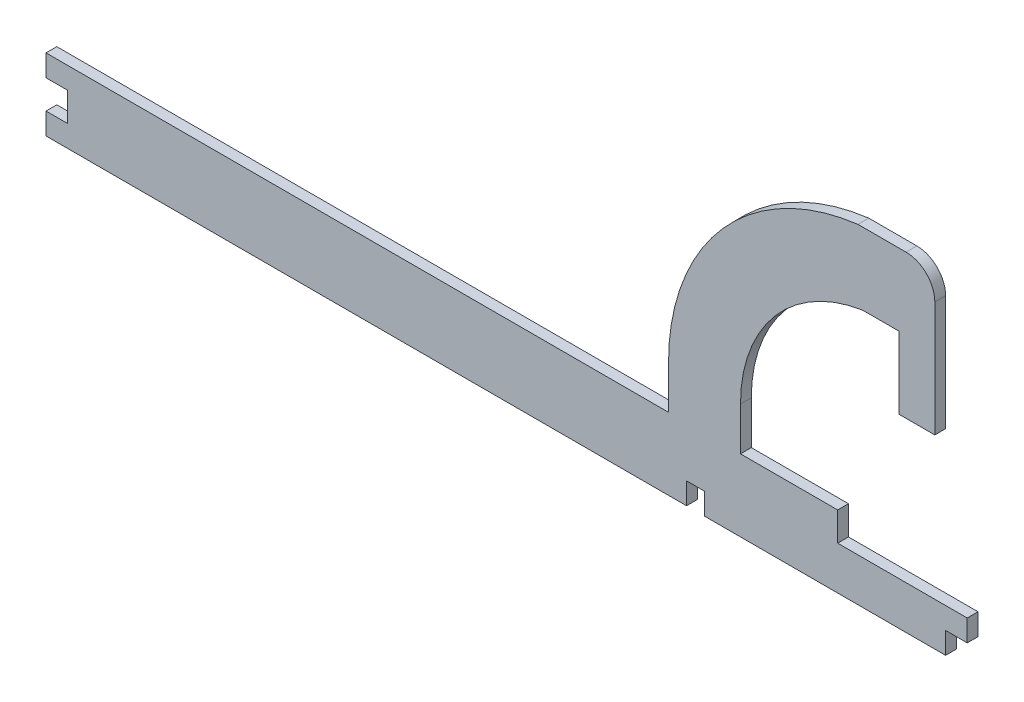
ISO-10303-21;
HEADER;
FILE_DESCRIPTION(('STEP AP214'),'2;1');
FILE_NAME('part.step','',(''),(''),'','','');
FILE_SCHEMA(('AUTOMOTIVE_DESIGN { 1 0 10303 214 1 1 1 1 }'));
ENDSEC;
DATA;
#1=APPLICATION_CONTEXT('core data for automotive mechanical design processes');
#2=APPLICATION_PROTOCOL_DEFINITION('international standard','automotive_design',2000,#1);
#3=PRODUCT_CONTEXT('',#1,'mechanical');
#4=PRODUCT('Part','Part','',(#3));
#5=PRODUCT_RELATED_PRODUCT_CATEGORY('part','',(#4));
#6=PRODUCT_DEFINITION_FORMATION('','',#4);
#7=PRODUCT_DEFINITION_CONTEXT('part definition',#1,'design');
#8=PRODUCT_DEFINITION('design','',#6,#7);
#9=PRODUCT_DEFINITION_SHAPE('','',#8);
#10=(LENGTH_UNIT() NAMED_UNIT(*) SI_UNIT(.MILLI.,.METRE.));
#11=(NAMED_UNIT(*) PLANE_ANGLE_UNIT() SI_UNIT($,.RADIAN.));
#12=(NAMED_UNIT(*) SI_UNIT($,.STERADIAN.) SOLID_ANGLE_UNIT());
#13=UNCERTAINTY_MEASURE_WITH_UNIT(LENGTH_MEASURE(1.E-05),#10,'distance_accuracy_value','');
#14=(GEOMETRIC_REPRESENTATION_CONTEXT(3) GLOBAL_UNCERTAINTY_ASSIGNED_CONTEXT((#13)) GLOBAL_UNIT_ASSIGNED_CONTEXT((#10,
#11,#12)) REPRESENTATION_CONTEXT('',''));
#15=CARTESIAN_POINT('',(0.,0.,0.));
#16=DIRECTION('',(0.,0.,1.));
#17=DIRECTION('',(1.,0.,0.));
#18=AXIS2_PLACEMENT_3D('',#15,#16,#17);
#19=CARTESIAN_POINT('',(0.,0.,3.));
#20=DIRECTION('',(0.,1.,0.));
#21=DIRECTION('',(0.,0.,1.));
#22=AXIS2_PLACEMENT_3D('',#19,#20,#21);
#23=PLANE('',#22);
#24=DIRECTION('',(1.,0.,0.));
#25=VECTOR('',#24,1.);
#26=CARTESIAN_POINT('',(0.,0.,0.));
#27=LINE('',#26,#25);
#28=CARTESIAN_POINT('',(-6.,0.,0.));
#29=VERTEX_POINT('',#28);
#30=CARTESIAN_POINT('',(172.,0.,0.));
#31=VERTEX_POINT('',#30);
#32=EDGE_CURVE('E149',#29,#31,#27,.T.);
#33=ORIENTED_EDGE('',*,*,#32,.T.);
#34=DIRECTION('',(0.,0.,-1.));
#35=VECTOR('',#34,1.);
#36=CARTESIAN_POINT('',(172.,0.,3.));
#37=LINE('',#36,#35);
#38=CARTESIAN_POINT('',(172.,0.,3.));
#39=VERTEX_POINT('',#38);
#40=EDGE_CURVE('E11',#39,#31,#37,.T.);
#41=ORIENTED_EDGE('',*,*,#40,.F.);
#42=DIRECTION('',(1.,0.,0.));
#43=VECTOR('',#42,1.);
#44=CARTESIAN_POINT('',(-6.,0.,3.));
#45=LINE('',#44,#43);
#46=CARTESIAN_POINT('',(-6.,0.,3.));
#47=VERTEX_POINT('',#46);
#48=EDGE_CURVE('E155',#47,#39,#45,.T.);
#49=ORIENTED_EDGE('',*,*,#48,.F.);
#50=DIRECTION('',(0.,0.,-1.));
#51=VECTOR('',#50,1.);
#52=CARTESIAN_POINT('',(-6.,0.,3.));
#53=LINE('',#52,#51);
#54=EDGE_CURVE('E250',#47,#29,#53,.T.);
#55=ORIENTED_EDGE('',*,*,#54,.T.);
#56=EDGE_LOOP('',(#33,#41,#49,#55));
#57=FACE_BOUND('',#56,.T.);
#58=ADVANCED_FACE('F39',(#57),#23,.F.);
#59=CARTESIAN_POINT('',(172.,0.,3.));
#60=DIRECTION('',(-1.,0.,0.));
#61=DIRECTION('',(0.,0.,1.));
#62=AXIS2_PLACEMENT_3D('',#59,#60,#61);
#63=PLANE('',#62);
#64=DIRECTION('',(0.,1.,0.));
#65=VECTOR('',#64,1.);
#66=CARTESIAN_POINT('',(172.,0.,0.));
#67=LINE('',#66,#65);
#68=CARTESIAN_POINT('',(172.,6.,0.));
#69=VERTEX_POINT('',#68);
#70=EDGE_CURVE('E256',#31,#69,#67,.T.);
#71=ORIENTED_EDGE('',*,*,#70,.T.);
#72=DIRECTION('',(0.,0.,-1.));
#73=VECTOR('',#72,1.);
#74=CARTESIAN_POINT('',(172.,6.,3.));
#75=LINE('',#74,#73);
#76=CARTESIAN_POINT('',(172.,6.,3.));
#77=VERTEX_POINT('',#76);
#78=EDGE_CURVE('E48',#77,#69,#75,.T.);
#79=ORIENTED_EDGE('',*,*,#78,.F.);
#80=DIRECTION('',(0.,1.,0.));
#81=VECTOR('',#80,1.);
#82=CARTESIAN_POINT('',(172.,0.,3.));
#83=LINE('',#82,#81);
#84=EDGE_CURVE('E524',#39,#77,#83,.T.);
#85=ORIENTED_EDGE('',*,*,#84,.F.);
#86=ORIENTED_EDGE('',*,*,#40,.T.);
#87=EDGE_LOOP('',(#71,#79,#85,#86));
#88=FACE_BOUND('',#87,.T.);
#89=ADVANCED_FACE('F529',(#88),#63,.F.);
#90=CARTESIAN_POINT('',(177.,6.,3.));
#91=DIRECTION('',(0.,1.,0.));
#92=DIRECTION('',(-1.,0.,0.));
#93=AXIS2_PLACEMENT_3D('',#90,#91,#92);
#94=PLANE('',#93);
#95=DIRECTION('',(1.,0.,0.));
#96=VECTOR('',#95,1.);
#97=CARTESIAN_POINT('',(177.,6.,0.));
#98=LINE('',#97,#96);
#99=CARTESIAN_POINT('',(177.,6.,0.));
#100=VERTEX_POINT('',#99);
#101=EDGE_CURVE('E259',#69,#100,#98,.T.);
#102=ORIENTED_EDGE('',*,*,#101,.T.);
#103=DIRECTION('',(0.,0.,-1.));
#104=VECTOR('',#103,1.);
#105=CARTESIAN_POINT('',(177.,6.,3.));
#106=LINE('',#105,#104);
#107=CARTESIAN_POINT('',(177.,6.,3.));
#108=VERTEX_POINT('',#107);
#109=EDGE_CURVE('E421',#108,#100,#106,.T.);
#110=ORIENTED_EDGE('',*,*,#109,.F.);
#111=DIRECTION('',(1.,0.,0.));
#112=VECTOR('',#111,1.);
#113=CARTESIAN_POINT('',(177.,6.,3.));
#114=LINE('',#113,#112);
#115=EDGE_CURVE('E432',#77,#108,#114,.T.);
#116=ORIENTED_EDGE('',*,*,#115,.F.);
#117=ORIENTED_EDGE('',*,*,#78,.T.);
#118=EDGE_LOOP('',(#102,#110,#116,#117));
#119=FACE_BOUND('',#118,.T.);
#120=ADVANCED_FACE('F430',(#119),#94,.F.);
#121=CARTESIAN_POINT('',(177.,0.,3.));
#122=DIRECTION('',(1.,0.,0.));
#123=DIRECTION('',(0.,0.,-1.));
#124=AXIS2_PLACEMENT_3D('',#121,#122,#123);
#125=PLANE('',#124);
#126=DIRECTION('',(0.,-1.,0.));
#127=VECTOR('',#126,1.);
#128=CARTESIAN_POINT('',(177.,0.,0.));
#129=LINE('',#128,#127);
#130=CARTESIAN_POINT('',(177.,0.,0.));
#131=VERTEX_POINT('',#130);
#132=EDGE_CURVE('E262',#100,#131,#129,.T.);
#133=ORIENTED_EDGE('',*,*,#132,.T.);
#134=DIRECTION('',(0.,0.,-1.));
#135=VECTOR('',#134,1.);
#136=CARTESIAN_POINT('',(177.,0.,3.));
#137=LINE('',#136,#135);
#138=CARTESIAN_POINT('',(177.,0.,3.));
#139=VERTEX_POINT('',#138);
#140=EDGE_CURVE('E417',#139,#131,#137,.T.);
#141=ORIENTED_EDGE('',*,*,#140,.F.);
#142=DIRECTION('',(0.,-1.,0.));
#143=VECTOR('',#142,1.);
#144=CARTESIAN_POINT('',(177.,0.,3.));
#145=LINE('',#144,#143);
#146=EDGE_CURVE('E451',#108,#139,#145,.T.);
#147=ORIENTED_EDGE('',*,*,#146,.F.);
#148=ORIENTED_EDGE('',*,*,#109,.T.);
#149=EDGE_LOOP('',(#133,#141,#147,#148));
#150=FACE_BOUND('',#149,.T.);
#151=ADVANCED_FACE('F441',(#150),#125,.F.);
#152=CARTESIAN_POINT('',(177.,0.,3.));
#153=DIRECTION('',(0.,1.,0.));
#154=DIRECTION('',(0.,0.,1.));
#155=AXIS2_PLACEMENT_3D('',#152,#153,#154);
#156=PLANE('',#155);
#157=DIRECTION('',(1.,0.,0.));
#158=VECTOR('',#157,1.);
#159=CARTESIAN_POINT('',(177.,0.,0.));
#160=LINE('',#159,#158);
#161=CARTESIAN_POINT('',(244.,0.,0.));
#162=VERTEX_POINT('',#161);
#163=EDGE_CURVE('E265',#131,#162,#160,.T.);
#164=ORIENTED_EDGE('',*,*,#163,.T.);
#165=DIRECTION('',(0.,0.,-1.));
#166=VECTOR('',#165,1.);
#167=CARTESIAN_POINT('',(244.,0.,3.));
#168=LINE('',#167,#166);
#169=CARTESIAN_POINT('',(244.,0.,3.));
#170=VERTEX_POINT('',#169);
#171=EDGE_CURVE('E413',#170,#162,#168,.T.);
#172=ORIENTED_EDGE('',*,*,#171,.F.);
#173=DIRECTION('',(1.,0.,0.));
#174=VECTOR('',#173,1.);
#175=CARTESIAN_POINT('',(177.,0.,3.));
#176=LINE('',#175,#174);
#177=EDGE_CURVE('E447',#139,#170,#176,.T.);
#178=ORIENTED_EDGE('',*,*,#177,.F.);
#179=ORIENTED_EDGE('',*,*,#140,.T.);
#180=EDGE_LOOP('',(#164,#172,#178,#179));
#181=FACE_BOUND('',#180,.T.);
#182=ADVANCED_FACE('F445',(#181),#156,.F.);
#183=CARTESIAN_POINT('',(244.,6.,3.));
#184=DIRECTION('',(-1.,0.,0.));
#185=DIRECTION('',(0.,0.,1.));
#186=AXIS2_PLACEMENT_3D('',#183,#184,#185);
#187=PLANE('',#186);
#188=DIRECTION('',(0.,1.,0.));
#189=VECTOR('',#188,1.);
#190=CARTESIAN_POINT('',(244.,6.,0.));
#191=LINE('',#190,#189);
#192=CARTESIAN_POINT('',(244.,6.,0.));
#193=VERTEX_POINT('',#192);
#194=EDGE_CURVE('E268',#162,#193,#191,.T.);
#195=ORIENTED_EDGE('',*,*,#194,.T.);
#196=DIRECTION('',(0.,0.,-1.));
#197=VECTOR('',#196,1.);
#198=CARTESIAN_POINT('',(244.,6.,3.));
#199=LINE('',#198,#197);
#200=CARTESIAN_POINT('',(244.,6.,3.));
#201=VERTEX_POINT('',#200);
#202=EDGE_CURVE('E409',#201,#193,#199,.T.);
#203=ORIENTED_EDGE('',*,*,#202,.F.);
#204=DIRECTION('',(0.,1.,0.));
#205=VECTOR('',#204,1.);
#206=CARTESIAN_POINT('',(244.,6.,3.));
#207=LINE('',#206,#205);
#208=EDGE_CURVE('E450',#170,#201,#207,.T.);
#209=ORIENTED_EDGE('',*,*,#208,.F.);
#210=ORIENTED_EDGE('',*,*,#171,.T.);
#211=EDGE_LOOP('',(#195,#203,#209,#210));
#212=FACE_BOUND('',#211,.T.);
#213=ADVANCED_FACE('F541',(#212),#187,.F.);
#214=CARTESIAN_POINT('',(250.,6.,3.));
#215=DIRECTION('',(0.,1.,0.));
#216=DIRECTION('',(-1.,0.,0.));
#217=AXIS2_PLACEMENT_3D('',#214,#215,#216);
#218=PLANE('',#217);
#219=DIRECTION('',(1.,0.,0.));
#220=VECTOR('',#219,1.);
#221=CARTESIAN_POINT('',(250.,6.,0.));
#222=LINE('',#221,#220);
#223=CARTESIAN_POINT('',(250.,6.,0.));
#224=VERTEX_POINT('',#223);
#225=EDGE_CURVE('E271',#193,#224,#222,.T.);
#226=ORIENTED_EDGE('',*,*,#225,.T.);
#227=DIRECTION('',(0.,0.,-1.));
#228=VECTOR('',#227,1.);
#229=CARTESIAN_POINT('',(250.,6.,3.));
#230=LINE('',#229,#228);
#231=CARTESIAN_POINT('',(250.,6.,3.));
#232=VERTEX_POINT('',#231);
#233=EDGE_CURVE('E405',#232,#224,#230,.T.);
#234=ORIENTED_EDGE('',*,*,#233,.F.);
#235=DIRECTION('',(1.,0.,0.));
#236=VECTOR('',#235,1.);
#237=CARTESIAN_POINT('',(250.,6.,3.));
#238=LINE('',#237,#236);
#239=EDGE_CURVE('E455',#201,#232,#238,.T.);
#240=ORIENTED_EDGE('',*,*,#239,.F.);
#241=ORIENTED_EDGE('',*,*,#202,.T.);
#242=EDGE_LOOP('',(#226,#234,#240,#241));
#243=FACE_BOUND('',#242,.T.);
#244=ADVANCED_FACE('F544',(#243),#218,.F.);
#245=CARTESIAN_POINT('',(250.,12.,3.));
#246=DIRECTION('',(-1.,0.,0.));
#247=DIRECTION('',(0.,0.,1.));
#248=AXIS2_PLACEMENT_3D('',#245,#246,#247);
#249=PLANE('',#248);
#250=DIRECTION('',(0.,1.,0.));
#251=VECTOR('',#250,1.);
#252=CARTESIAN_POINT('',(250.,12.,0.));
#253=LINE('',#252,#251);
#254=CARTESIAN_POINT('',(250.,12.,0.));
#255=VERTEX_POINT('',#254);
#256=EDGE_CURVE('E274',#224,#255,#253,.T.);
#257=ORIENTED_EDGE('',*,*,#256,.T.);
#258=DIRECTION('',(0.,0.,-1.));
#259=VECTOR('',#258,1.);
#260=CARTESIAN_POINT('',(250.,12.,3.));
#261=LINE('',#260,#259);
#262=CARTESIAN_POINT('',(250.,12.,3.));
#263=VERTEX_POINT('',#262);
#264=EDGE_CURVE('E401',#263,#255,#261,.T.);
#265=ORIENTED_EDGE('',*,*,#264,.F.);
#266=DIRECTION('',(0.,1.,0.));
#267=VECTOR('',#266,1.);
#268=CARTESIAN_POINT('',(250.,12.,3.));
#269=LINE('',#268,#267);
#270=EDGE_CURVE('E462',#232,#263,#269,.T.);
#271=ORIENTED_EDGE('',*,*,#270,.F.);
#272=ORIENTED_EDGE('',*,*,#233,.T.);
#273=EDGE_LOOP('',(#257,#265,#271,#272));
#274=FACE_BOUND('',#273,.T.);
#275=ADVANCED_FACE('F548',(#274),#249,.F.);
#276=CARTESIAN_POINT('',(214.,12.,3.));
#277=DIRECTION('',(0.,-1.,0.));
#278=DIRECTION('',(0.,0.,-1.));
#279=AXIS2_PLACEMENT_3D('',#276,#277,#278);
#280=PLANE('',#279);
#281=DIRECTION('',(-1.,0.,0.));
#282=VECTOR('',#281,1.);
#283=CARTESIAN_POINT('',(214.,12.,0.));
#284=LINE('',#283,#282);
#285=CARTESIAN_POINT('',(214.,12.,0.));
#286=VERTEX_POINT('',#285);
#287=EDGE_CURVE('E278',#255,#286,#284,.T.);
#288=ORIENTED_EDGE('',*,*,#287,.T.);
#289=DIRECTION('',(0.,0.,-1.));
#290=VECTOR('',#289,1.);
#291=CARTESIAN_POINT('',(214.,12.,3.));
#292=LINE('',#291,#290);
#293=CARTESIAN_POINT('',(214.,12.,3.));
#294=VERTEX_POINT('',#293);
#295=EDGE_CURVE('E397',#294,#286,#292,.T.);
#296=ORIENTED_EDGE('',*,*,#295,.F.);
#297=DIRECTION('',(-1.,0.,0.));
#298=VECTOR('',#297,1.);
#299=CARTESIAN_POINT('',(244.,12.,3.));
#300=LINE('',#299,#298);
#301=EDGE_CURVE('E465',#263,#294,#300,.T.);
#302=ORIENTED_EDGE('',*,*,#301,.F.);
#303=ORIENTED_EDGE('',*,*,#264,.T.);
#304=EDGE_LOOP('',(#288,#296,#302,#303));
#305=FACE_BOUND('',#304,.T.);
#306=ADVANCED_FACE('F552',(#305),#280,.F.);
#307=CARTESIAN_POINT('',(214.,20.,3.));
#308=DIRECTION('',(-1.,0.,0.));
#309=DIRECTION('',(0.,0.,1.));
#310=AXIS2_PLACEMENT_3D('',#307,#308,#309);
#311=PLANE('',#310);
#312=DIRECTION('',(0.,1.,0.));
#313=VECTOR('',#312,1.);
#314=CARTESIAN_POINT('',(214.,20.,0.));
#315=LINE('',#314,#313);
#316=CARTESIAN_POINT('',(214.,20.,0.));
#317=VERTEX_POINT('',#316);
#318=EDGE_CURVE('E281',#286,#317,#315,.T.);
#319=ORIENTED_EDGE('',*,*,#318,.T.);
#320=DIRECTION('',(0.,0.,-1.));
#321=VECTOR('',#320,1.);
#322=CARTESIAN_POINT('',(214.,20.,3.));
#323=LINE('',#322,#321);
#324=CARTESIAN_POINT('',(214.,20.,3.));
#325=VERTEX_POINT('',#324);
#326=EDGE_CURVE('E393',#325,#317,#323,.T.);
#327=ORIENTED_EDGE('',*,*,#326,.F.);
#328=DIRECTION('',(0.,1.,0.));
#329=VECTOR('',#328,1.);
#330=CARTESIAN_POINT('',(214.,20.,3.));
#331=LINE('',#330,#329);
#332=EDGE_CURVE('E468',#294,#325,#331,.T.);
#333=ORIENTED_EDGE('',*,*,#332,.F.);
#334=ORIENTED_EDGE('',*,*,#295,.T.);
#335=EDGE_LOOP('',(#319,#327,#333,#334));
#336=FACE_BOUND('',#335,.T.);
#337=ADVANCED_FACE('F556',(#336),#311,.F.);
#338=CARTESIAN_POINT('',(187.,20.,3.));
#339=DIRECTION('',(0.,-1.,0.));
#340=DIRECTION('',(0.,0.,-1.));
#341=AXIS2_PLACEMENT_3D('',#338,#339,#340);
#342=PLANE('',#341);
#343=DIRECTION('',(-1.,0.,0.));
#344=VECTOR('',#343,1.);
#345=CARTESIAN_POINT('',(187.,20.,0.));
#346=LINE('',#345,#344);
#347=CARTESIAN_POINT('',(187.,20.,0.));
#348=VERTEX_POINT('',#347);
#349=EDGE_CURVE('E284',#317,#348,#346,.T.);
#350=ORIENTED_EDGE('',*,*,#349,.T.);
#351=DIRECTION('',(0.,0.,-1.));
#352=VECTOR('',#351,1.);
#353=CARTESIAN_POINT('',(187.,20.,3.));
#354=LINE('',#353,#352);
#355=CARTESIAN_POINT('',(187.,20.,3.));
#356=VERTEX_POINT('',#355);
#357=EDGE_CURVE('E389',#356,#348,#354,.T.);
#358=ORIENTED_EDGE('',*,*,#357,.F.);
#359=DIRECTION('',(-1.,0.,0.));
#360=VECTOR('',#359,1.);
#361=CARTESIAN_POINT('',(187.,20.,3.));
#362=LINE('',#361,#360);
#363=EDGE_CURVE('E471',#325,#356,#362,.T.);
#364=ORIENTED_EDGE('',*,*,#363,.F.);
#365=ORIENTED_EDGE('',*,*,#326,.T.);
#366=EDGE_LOOP('',(#350,#358,#364,#365));
#367=FACE_BOUND('',#366,.T.);
#368=ADVANCED_FACE('F560',(#367),#342,.F.);
#369=CARTESIAN_POINT('',(187.,20.,3.));
#370=DIRECTION('',(-1.,0.,0.));
#371=DIRECTION('',(0.,0.,1.));
#372=AXIS2_PLACEMENT_3D('',#369,#370,#371);
#373=PLANE('',#372);
#374=DIRECTION('',(0.,1.,0.));
#375=VECTOR('',#374,1.);
#376=CARTESIAN_POINT('',(187.,20.,0.));
#377=LINE('',#376,#375);
#378=CARTESIAN_POINT('',(187.,32.,0.));
#379=VERTEX_POINT('',#378);
#380=EDGE_CURVE('E287',#348,#379,#377,.T.);
#381=ORIENTED_EDGE('',*,*,#380,.T.);
#382=DIRECTION('',(0.,0.,-1.));
#383=VECTOR('',#382,1.);
#384=CARTESIAN_POINT('',(187.,32.,3.));
#385=LINE('',#384,#383);
#386=CARTESIAN_POINT('',(187.,32.,3.));
#387=VERTEX_POINT('',#386);
#388=EDGE_CURVE('E385',#387,#379,#385,.T.);
#389=ORIENTED_EDGE('',*,*,#388,.F.);
#390=DIRECTION('',(0.,1.,0.));
#391=VECTOR('',#390,1.);
#392=CARTESIAN_POINT('',(187.,20.,3.));
#393=LINE('',#392,#391);
#394=EDGE_CURVE('E474',#356,#387,#393,.T.);
#395=ORIENTED_EDGE('',*,*,#394,.F.);
#396=ORIENTED_EDGE('',*,*,#357,.T.);
#397=EDGE_LOOP('',(#381,#389,#395,#396));
#398=FACE_BOUND('',#397,.T.);
#399=ADVANCED_FACE('F564',(#398),#373,.F.);
#400=CARTESIAN_POINT('',(227.,32.,3.));
#401=DIRECTION('',(0.,0.,-1.));
#402=DIRECTION('',(-1.,0.,0.));
#403=AXIS2_PLACEMENT_3D('',#400,#401,#402);
#404=CYLINDRICAL_SURFACE('',#403,40.);
#405=CARTESIAN_POINT('',(227.,32.,0.));
#406=DIRECTION('',(0.,0.,-1.));
#407=DIRECTION('',(1.,0.,0.));
#408=AXIS2_PLACEMENT_3D('',#405,#406,#407);
#409=CIRCLE('',#408,40.);
#410=CARTESIAN_POINT('',(221.,71.5474398665704,0.));
#411=VERTEX_POINT('',#410);
#412=EDGE_CURVE('E290',#379,#411,#409,.T.);
#413=ORIENTED_EDGE('',*,*,#412,.T.);
#414=DIRECTION('',(0.,0.,-1.));
#415=VECTOR('',#414,1.);
#416=CARTESIAN_POINT('',(221.,71.5474398665704,3.));
#417=LINE('',#416,#415);
#418=CARTESIAN_POINT('',(221.,71.5474398665704,3.));
#419=VERTEX_POINT('',#418);
#420=EDGE_CURVE('E381',#419,#411,#417,.T.);
#421=ORIENTED_EDGE('',*,*,#420,.F.);
#422=CARTESIAN_POINT('',(227.,32.,3.));
#423=DIRECTION('',(0.,0.,-1.));
#424=DIRECTION('',(1.,0.,0.));
#425=AXIS2_PLACEMENT_3D('',#422,#423,#424);
#426=CIRCLE('',#425,40.);
#427=EDGE_CURVE('E477',#387,#419,#426,.T.);
#428=ORIENTED_EDGE('',*,*,#427,.F.);
#429=ORIENTED_EDGE('',*,*,#388,.T.);
#430=EDGE_LOOP('',(#413,#421,#428,#429));
#431=FACE_BOUND('',#430,.T.);
#432=ADVANCED_FACE('F568',(#431),#404,.F.);
#433=CARTESIAN_POINT('',(231.,71.5474398665704,3.));
#434=DIRECTION('',(0.,1.,0.));
#435=DIRECTION('',(0.,0.,1.));
#436=AXIS2_PLACEMENT_3D('',#433,#434,#435);
#437=PLANE('',#436);
#438=DIRECTION('',(1.,0.,0.));
#439=VECTOR('',#438,1.);
#440=CARTESIAN_POINT('',(231.,71.5474398665704,0.));
#441=LINE('',#440,#439);
#442=CARTESIAN_POINT('',(231.,71.5474398665704,0.));
#443=VERTEX_POINT('',#442);
#444=EDGE_CURVE('E293',#411,#443,#441,.T.);
#445=ORIENTED_EDGE('',*,*,#444,.T.);
#446=DIRECTION('',(0.,0.,-1.));
#447=VECTOR('',#446,1.);
#448=CARTESIAN_POINT('',(231.,71.5474398665704,3.));
#449=LINE('',#448,#447);
#450=CARTESIAN_POINT('',(231.,71.5474398665704,3.));
#451=VERTEX_POINT('',#450);
#452=EDGE_CURVE('E377',#451,#443,#449,.T.);
#453=ORIENTED_EDGE('',*,*,#452,.F.);
#454=DIRECTION('',(1.,0.,0.));
#455=VECTOR('',#454,1.);
#456=CARTESIAN_POINT('',(231.,71.5474398665704,3.));
#457=LINE('',#456,#455);
#458=EDGE_CURVE('E480',#419,#451,#457,.T.);
#459=ORIENTED_EDGE('',*,*,#458,.F.);
#460=ORIENTED_EDGE('',*,*,#420,.T.);
#461=EDGE_LOOP('',(#445,#453,#459,#460));
#462=FACE_BOUND('',#461,.T.);
#463=ADVANCED_FACE('F572',(#462),#437,.F.);
#464=CARTESIAN_POINT('',(231.,71.5474398665704,3.));
#465=DIRECTION('',(1.,0.,0.));
#466=DIRECTION('',(0.,0.,-1.));
#467=AXIS2_PLACEMENT_3D('',#464,#465,#466);
#468=PLANE('',#467);
#469=DIRECTION('',(0.,-1.,0.));
#470=VECTOR('',#469,1.);
#471=CARTESIAN_POINT('',(231.,71.5474398665704,0.));
#472=LINE('',#471,#470);
#473=CARTESIAN_POINT('',(231.,51.5474398665704,0.));
#474=VERTEX_POINT('',#473);
#475=EDGE_CURVE('E296',#443,#474,#472,.T.);
#476=ORIENTED_EDGE('',*,*,#475,.T.);
#477=DIRECTION('',(0.,0.,-1.));
#478=VECTOR('',#477,1.);
#479=CARTESIAN_POINT('',(231.,51.5474398665704,3.));
#480=LINE('',#479,#478);
#481=CARTESIAN_POINT('',(231.,51.5474398665704,3.));
#482=VERTEX_POINT('',#481);
#483=EDGE_CURVE('E373',#482,#474,#480,.T.);
#484=ORIENTED_EDGE('',*,*,#483,.F.);
#485=DIRECTION('',(0.,-1.,0.));
#486=VECTOR('',#485,1.);
#487=CARTESIAN_POINT('',(231.,71.5474398665704,3.));
#488=LINE('',#487,#486);
#489=EDGE_CURVE('E483',#451,#482,#488,.T.);
#490=ORIENTED_EDGE('',*,*,#489,.F.);
#491=ORIENTED_EDGE('',*,*,#452,.T.);
#492=EDGE_LOOP('',(#476,#484,#490,#491));
#493=FACE_BOUND('',#492,.T.);
#494=ADVANCED_FACE('F576',(#493),#468,.F.);
#495=CARTESIAN_POINT('',(231.,51.5474398665704,3.));
#496=DIRECTION('',(0.,1.,0.));
#497=DIRECTION('',(0.,0.,1.));
#498=AXIS2_PLACEMENT_3D('',#495,#496,#497);
#499=PLANE('',#498);
#500=DIRECTION('',(1.,0.,0.));
#501=VECTOR('',#500,1.);
#502=CARTESIAN_POINT('',(231.,51.5474398665704,0.));
#503=LINE('',#502,#501);
#504=CARTESIAN_POINT('',(241.,51.5474398665704,0.));
#505=VERTEX_POINT('',#504);
#506=EDGE_CURVE('E299',#474,#505,#503,.T.);
#507=ORIENTED_EDGE('',*,*,#506,.T.);
#508=DIRECTION('',(0.,0.,-1.));
#509=VECTOR('',#508,1.);
#510=CARTESIAN_POINT('',(241.,51.5474398665704,3.));
#511=LINE('',#510,#509);
#512=CARTESIAN_POINT('',(241.,51.5474398665704,3.));
#513=VERTEX_POINT('',#512);
#514=EDGE_CURVE('E369',#513,#505,#511,.T.);
#515=ORIENTED_EDGE('',*,*,#514,.F.);
#516=DIRECTION('',(1.,0.,0.));
#517=VECTOR('',#516,1.);
#518=CARTESIAN_POINT('',(231.,51.5474398665704,3.));
#519=LINE('',#518,#517);
#520=EDGE_CURVE('E486',#482,#513,#519,.T.);
#521=ORIENTED_EDGE('',*,*,#520,.F.);
#522=ORIENTED_EDGE('',*,*,#483,.T.);
#523=EDGE_LOOP('',(#507,#515,#521,#522));
#524=FACE_BOUND('',#523,.T.);
#525=ADVANCED_FACE('F580',(#524),#499,.F.);
#526=CARTESIAN_POINT('',(241.,83.5474398665704,3.));
#527=DIRECTION('',(-1.,0.,0.));
#528=DIRECTION('',(0.,0.,1.));
#529=AXIS2_PLACEMENT_3D('',#526,#527,#528);
#530=PLANE('',#529);
#531=DIRECTION('',(0.,1.,0.));
#532=VECTOR('',#531,1.);
#533=CARTESIAN_POINT('',(241.,83.5474398665704,0.));
#534=LINE('',#533,#532);
#535=CARTESIAN_POINT('',(241.,83.5474398665704,0.));
#536=VERTEX_POINT('',#535);
#537=EDGE_CURVE('E302',#505,#536,#534,.T.);
#538=ORIENTED_EDGE('',*,*,#537,.T.);
#539=DIRECTION('',(0.,0.,-1.));
#540=VECTOR('',#539,1.);
#541=CARTESIAN_POINT('',(241.,83.5474398665704,3.));
#542=LINE('',#541,#540);
#543=CARTESIAN_POINT('',(241.,83.5474398665704,3.));
#544=VERTEX_POINT('',#543);
#545=EDGE_CURVE('E365',#544,#536,#542,.T.);
#546=ORIENTED_EDGE('',*,*,#545,.F.);
#547=DIRECTION('',(0.,1.,0.));
#548=VECTOR('',#547,1.);
#549=CARTESIAN_POINT('',(241.,83.5474398665704,3.));
#550=LINE('',#549,#548);
#551=EDGE_CURVE('E489',#513,#544,#550,.T.);
#552=ORIENTED_EDGE('',*,*,#551,.F.);
#553=ORIENTED_EDGE('',*,*,#514,.T.);
#554=EDGE_LOOP('',(#538,#546,#552,#553));
#555=FACE_BOUND('',#554,.T.);
#556=ADVANCED_FACE('F584',(#555),#530,.F.);
#557=CARTESIAN_POINT('',(233.,83.5474398665704,3.));
#558=DIRECTION('',(0.,0.,-1.));
#559=DIRECTION('',(-1.,0.,0.));
#560=AXIS2_PLACEMENT_3D('',#557,#558,#559);
#561=CYLINDRICAL_SURFACE('',#560,8.00000000000001);
#562=CARTESIAN_POINT('',(233.,83.5474398665704,0.));
#563=DIRECTION('',(0.,0.,1.));
#564=DIRECTION('',(1.,0.,0.));
#565=AXIS2_PLACEMENT_3D('',#562,#563,#564);
#566=CIRCLE('',#565,8.00000000000001);
#567=CARTESIAN_POINT('',(233.,91.5474398665704,0.));
#568=VERTEX_POINT('',#567);
#569=EDGE_CURVE('E305',#536,#568,#566,.T.);
#570=ORIENTED_EDGE('',*,*,#569,.T.);
#571=DIRECTION('',(0.,0.,-1.));
#572=VECTOR('',#571,1.);
#573=CARTESIAN_POINT('',(233.,91.5474398665704,3.));
#574=LINE('',#573,#572);
#575=CARTESIAN_POINT('',(233.,91.5474398665704,3.));
#576=VERTEX_POINT('',#575);
#577=EDGE_CURVE('E361',#576,#568,#574,.T.);
#578=ORIENTED_EDGE('',*,*,#577,.F.);
#579=CARTESIAN_POINT('',(233.,83.5474398665704,3.));
#580=DIRECTION('',(0.,0.,1.));
#581=DIRECTION('',(1.,0.,0.));
#582=AXIS2_PLACEMENT_3D('',#579,#580,#581);
#583=CIRCLE('',#582,8.00000000000001);
#584=EDGE_CURVE('E492',#544,#576,#583,.T.);
#585=ORIENTED_EDGE('',*,*,#584,.F.);
#586=ORIENTED_EDGE('',*,*,#545,.T.);
#587=EDGE_LOOP('',(#570,#578,#585,#586));
#588=FACE_BOUND('',#587,.T.);
#589=ADVANCED_FACE('F588',(#588),#561,.T.);
#590=CARTESIAN_POINT('',(233.,91.5474398665704,3.));
#591=DIRECTION('',(0.,-1.,0.));
#592=DIRECTION('',(0.,0.,-1.));
#593=AXIS2_PLACEMENT_3D('',#590,#591,#592);
#594=PLANE('',#593);
#595=DIRECTION('',(-1.,0.,0.));
#596=VECTOR('',#595,1.);
#597=CARTESIAN_POINT('',(233.,91.5474398665704,0.));
#598=LINE('',#597,#596);
#599=CARTESIAN_POINT('',(219.644566271308,91.5474398665704,0.));
#600=VERTEX_POINT('',#599);
#601=EDGE_CURVE('E308',#568,#600,#598,.T.);
#602=ORIENTED_EDGE('',*,*,#601,.T.);
#603=DIRECTION('',(0.,0.,-1.));
#604=VECTOR('',#603,1.);
#605=CARTESIAN_POINT('',(219.644566271308,91.5474398665704,3.));
#606=LINE('',#605,#604);
#607=CARTESIAN_POINT('',(219.644566271308,91.5474398665704,3.));
#608=VERTEX_POINT('',#607);
#609=EDGE_CURVE('E357',#608,#600,#606,.T.);
#610=ORIENTED_EDGE('',*,*,#609,.F.);
#611=DIRECTION('',(-1.,0.,0.));
#612=VECTOR('',#611,1.);
#613=CARTESIAN_POINT('',(233.,91.5474398665704,3.));
#614=LINE('',#613,#612);
#615=EDGE_CURVE('E495',#576,#608,#614,.T.);
#616=ORIENTED_EDGE('',*,*,#615,.F.);
#617=ORIENTED_EDGE('',*,*,#577,.T.);
#618=EDGE_LOOP('',(#602,#610,#616,#617));
#619=FACE_BOUND('',#618,.T.);
#620=ADVANCED_FACE('F592',(#619),#594,.F.);
#621=CARTESIAN_POINT('',(227.,32.,3.));
#622=DIRECTION('',(0.,0.,-1.));
#623=DIRECTION('',(-1.,0.,0.));
#624=AXIS2_PLACEMENT_3D('',#621,#622,#623);
#625=CYLINDRICAL_SURFACE('',#624,60.);
#626=CARTESIAN_POINT('',(227.,32.,0.));
#627=DIRECTION('',(0.,0.,1.));
#628=DIRECTION('',(1.,0.,0.));
#629=AXIS2_PLACEMENT_3D('',#626,#627,#628);
#630=CIRCLE('',#629,60.);
#631=CARTESIAN_POINT('',(167.,32.,0.));
#632=VERTEX_POINT('',#631);
#633=EDGE_CURVE('E311',#600,#632,#630,.T.);
#634=ORIENTED_EDGE('',*,*,#633,.T.);
#635=DIRECTION('',(0.,0.,-1.));
#636=VECTOR('',#635,1.);
#637=CARTESIAN_POINT('',(167.,32.,3.));
#638=LINE('',#637,#636);
#639=CARTESIAN_POINT('',(167.,32.,3.));
#640=VERTEX_POINT('',#639);
#641=EDGE_CURVE('E353',#640,#632,#638,.T.);
#642=ORIENTED_EDGE('',*,*,#641,.F.);
#643=CARTESIAN_POINT('',(227.,32.,3.));
#644=DIRECTION('',(0.,0.,1.));
#645=DIRECTION('',(1.,0.,0.));
#646=AXIS2_PLACEMENT_3D('',#643,#644,#645);
#647=CIRCLE('',#646,60.);
#648=EDGE_CURVE('E498',#608,#640,#647,.T.);
#649=ORIENTED_EDGE('',*,*,#648,.F.);
#650=ORIENTED_EDGE('',*,*,#609,.T.);
#651=EDGE_LOOP('',(#634,#642,#649,#650));
#652=FACE_BOUND('',#651,.T.);
#653=ADVANCED_FACE('F596',(#652),#625,.T.);
#654=CARTESIAN_POINT('',(167.,32.,3.));
#655=DIRECTION('',(1.,0.,0.));
#656=DIRECTION('',(0.,0.,-1.));
#657=AXIS2_PLACEMENT_3D('',#654,#655,#656);
#658=PLANE('',#657);
#659=DIRECTION('',(0.,-1.,0.));
#660=VECTOR('',#659,1.);
#661=CARTESIAN_POINT('',(167.,32.,0.));
#662=LINE('',#661,#660);
#663=CARTESIAN_POINT('',(167.,20.,0.));
#664=VERTEX_POINT('',#663);
#665=EDGE_CURVE('E314',#632,#664,#662,.T.);
#666=ORIENTED_EDGE('',*,*,#665,.T.);
#667=DIRECTION('',(0.,0.,-1.));
#668=VECTOR('',#667,1.);
#669=CARTESIAN_POINT('',(167.,20.,3.));
#670=LINE('',#669,#668);
#671=CARTESIAN_POINT('',(167.,20.,3.));
#672=VERTEX_POINT('',#671);
#673=EDGE_CURVE('E349',#672,#664,#670,.T.);
#674=ORIENTED_EDGE('',*,*,#673,.F.);
#675=DIRECTION('',(0.,-1.,0.));
#676=VECTOR('',#675,1.);
#677=CARTESIAN_POINT('',(167.,32.,3.));
#678=LINE('',#677,#676);
#679=EDGE_CURVE('E501',#640,#672,#678,.T.);
#680=ORIENTED_EDGE('',*,*,#679,.F.);
#681=ORIENTED_EDGE('',*,*,#641,.T.);
#682=EDGE_LOOP('',(#666,#674,#680,#681));
#683=FACE_BOUND('',#682,.T.);
#684=ADVANCED_FACE('F600',(#683),#658,.F.);
#685=CARTESIAN_POINT('',(0.,20.,3.));
#686=DIRECTION('',(0.,-1.,0.));
#687=DIRECTION('',(0.,0.,-1.));
#688=AXIS2_PLACEMENT_3D('',#685,#686,#687);
#689=PLANE('',#688);
#690=DIRECTION('',(-1.,0.,0.));
#691=VECTOR('',#690,1.);
#692=CARTESIAN_POINT('',(0.,20.,0.));
#693=LINE('',#692,#691);
#694=CARTESIAN_POINT('',(-6.,20.,0.));
#695=VERTEX_POINT('',#694);
#696=EDGE_CURVE('E318',#664,#695,#693,.T.);
#697=ORIENTED_EDGE('',*,*,#696,.T.);
#698=DIRECTION('',(0.,0.,-1.));
#699=VECTOR('',#698,1.);
#700=CARTESIAN_POINT('',(-6.,20.,3.));
#701=LINE('',#700,#699);
#702=CARTESIAN_POINT('',(-6.,20.,3.));
#703=VERTEX_POINT('',#702);
#704=EDGE_CURVE('E345',#703,#695,#701,.T.);
#705=ORIENTED_EDGE('',*,*,#704,.F.);
#706=DIRECTION('',(-1.,0.,0.));
#707=VECTOR('',#706,1.);
#708=CARTESIAN_POINT('',(0.,20.,3.));
#709=LINE('',#708,#707);
#710=EDGE_CURVE('E504',#672,#703,#709,.T.);
#711=ORIENTED_EDGE('',*,*,#710,.F.);
#712=ORIENTED_EDGE('',*,*,#673,.T.);
#713=EDGE_LOOP('',(#697,#705,#711,#712));
#714=FACE_BOUND('',#713,.T.);
#715=ADVANCED_FACE('F604',(#714),#689,.F.);
#716=CARTESIAN_POINT('',(-6.,20.,3.));
#717=DIRECTION('',(1.,0.,0.));
#718=DIRECTION('',(0.,0.,-1.));
#719=AXIS2_PLACEMENT_3D('',#716,#717,#718);
#720=PLANE('',#719);
#721=DIRECTION('',(0.,-1.,0.));
#722=VECTOR('',#721,1.);
#723=CARTESIAN_POINT('',(-6.,20.,0.));
#724=LINE('',#723,#722);
#725=CARTESIAN_POINT('',(-6.,14.,0.));
#726=VERTEX_POINT('',#725);
#727=EDGE_CURVE('E321',#695,#726,#724,.T.);
#728=ORIENTED_EDGE('',*,*,#727,.T.);
#729=DIRECTION('',(0.,0.,-1.));
#730=VECTOR('',#729,1.);
#731=CARTESIAN_POINT('',(-6.,14.,3.));
#732=LINE('',#731,#730);
#733=CARTESIAN_POINT('',(-6.,14.,3.));
#734=VERTEX_POINT('',#733);
#735=EDGE_CURVE('E341',#734,#726,#732,.T.);
#736=ORIENTED_EDGE('',*,*,#735,.F.);
#737=DIRECTION('',(0.,-1.,0.));
#738=VECTOR('',#737,1.);
#739=CARTESIAN_POINT('',(-6.,20.,3.));
#740=LINE('',#739,#738);
#741=EDGE_CURVE('E507',#703,#734,#740,.T.);
#742=ORIENTED_EDGE('',*,*,#741,.F.);
#743=ORIENTED_EDGE('',*,*,#704,.T.);
#744=EDGE_LOOP('',(#728,#736,#742,#743));
#745=FACE_BOUND('',#744,.T.);
#746=ADVANCED_FACE('F515',(#745),#720,.F.);
#747=CARTESIAN_POINT('',(-6.,14.,3.));
#748=DIRECTION('',(0.,1.,0.));
#749=DIRECTION('',(0.,0.,1.));
#750=AXIS2_PLACEMENT_3D('',#747,#748,#749);
#751=PLANE('',#750);
#752=DIRECTION('',(1.,0.,0.));
#753=VECTOR('',#752,1.);
#754=CARTESIAN_POINT('',(-6.,14.,0.));
#755=LINE('',#754,#753);
#756=CARTESIAN_POINT('',(0.,14.,0.));
#757=VERTEX_POINT('',#756);
#758=EDGE_CURVE('E324',#726,#757,#755,.T.);
#759=ORIENTED_EDGE('',*,*,#758,.T.);
#760=DIRECTION('',(0.,0.,-1.));
#761=VECTOR('',#760,1.);
#762=CARTESIAN_POINT('',(0.,14.,3.));
#763=LINE('',#762,#761);
#764=CARTESIAN_POINT('',(0.,14.,3.));
#765=VERTEX_POINT('',#764);
#766=EDGE_CURVE('E243',#765,#757,#763,.T.);
#767=ORIENTED_EDGE('',*,*,#766,.F.);
#768=DIRECTION('',(1.,0.,0.));
#769=VECTOR('',#768,1.);
#770=CARTESIAN_POINT('',(-6.,14.,3.));
#771=LINE('',#770,#769);
#772=EDGE_CURVE('E232',#734,#765,#771,.T.);
#773=ORIENTED_EDGE('',*,*,#772,.F.);
#774=ORIENTED_EDGE('',*,*,#735,.T.);
#775=EDGE_LOOP('',(#759,#767,#773,#774));
#776=FACE_BOUND('',#775,.T.);
#777=ADVANCED_FACE('F519',(#776),#751,.F.);
#778=CARTESIAN_POINT('',(0.,14.,3.));
#779=DIRECTION('',(1.,0.,0.));
#780=DIRECTION('',(0.,1.,0.));
#781=AXIS2_PLACEMENT_3D('',#778,#779,#780);
#782=PLANE('',#781);
#783=DIRECTION('',(0.,-1.,0.));
#784=VECTOR('',#783,1.);
#785=CARTESIAN_POINT('',(0.,14.,0.));
#786=LINE('',#785,#784);
#787=CARTESIAN_POINT('',(0.,6.,0.));
#788=VERTEX_POINT('',#787);
#789=EDGE_CURVE('E241',#757,#788,#786,.T.);
#790=ORIENTED_EDGE('',*,*,#789,.T.);
#791=DIRECTION('',(0.,0.,-1.));
#792=VECTOR('',#791,1.);
#793=CARTESIAN_POINT('',(0.,6.,3.));
#794=LINE('',#793,#792);
#795=CARTESIAN_POINT('',(0.,6.,3.));
#796=VERTEX_POINT('',#795);
#797=EDGE_CURVE('E238',#796,#788,#794,.T.);
#798=ORIENTED_EDGE('',*,*,#797,.F.);
#799=DIRECTION('',(0.,-1.,0.));
#800=VECTOR('',#799,1.);
#801=CARTESIAN_POINT('',(0.,14.,3.));
#802=LINE('',#801,#800);
#803=EDGE_CURVE('E226',#765,#796,#802,.T.);
#804=ORIENTED_EDGE('',*,*,#803,.F.);
#805=ORIENTED_EDGE('',*,*,#766,.T.);
#806=EDGE_LOOP('',(#790,#798,#804,#805));
#807=FACE_BOUND('',#806,.T.);
#808=ADVANCED_FACE('F239',(#807),#782,.F.);
#809=CARTESIAN_POINT('',(0.,6.,3.));
#810=DIRECTION('',(0.,-1.,0.));
#811=DIRECTION('',(0.,0.,-1.));
#812=AXIS2_PLACEMENT_3D('',#809,#810,#811);
#813=PLANE('',#812);
#814=DIRECTION('',(-1.,0.,0.));
#815=VECTOR('',#814,1.);
#816=CARTESIAN_POINT('',(0.,6.,0.));
#817=LINE('',#816,#815);
#818=CARTESIAN_POINT('',(-6.,6.,0.));
#819=VERTEX_POINT('',#818);
#820=EDGE_CURVE('E142',#788,#819,#817,.T.);
#821=ORIENTED_EDGE('',*,*,#820,.T.);
#822=DIRECTION('',(0.,0.,-1.));
#823=VECTOR('',#822,1.);
#824=CARTESIAN_POINT('',(-6.,6.,3.));
#825=LINE('',#824,#823);
#826=CARTESIAN_POINT('',(-6.,6.,3.));
#827=VERTEX_POINT('',#826);
#828=EDGE_CURVE('E244',#827,#819,#825,.T.);
#829=ORIENTED_EDGE('',*,*,#828,.F.);
#830=DIRECTION('',(-1.,0.,0.));
#831=VECTOR('',#830,1.);
#832=CARTESIAN_POINT('',(0.,6.,3.));
#833=LINE('',#832,#831);
#834=EDGE_CURVE('E230',#796,#827,#833,.T.);
#835=ORIENTED_EDGE('',*,*,#834,.F.);
#836=ORIENTED_EDGE('',*,*,#797,.T.);
#837=EDGE_LOOP('',(#821,#829,#835,#836));
#838=FACE_BOUND('',#837,.T.);
#839=ADVANCED_FACE('F246',(#838),#813,.F.);
#840=CARTESIAN_POINT('',(-6.,6.,3.));
#841=DIRECTION('',(1.,0.,0.));
#842=DIRECTION('',(0.,1.,0.));
#843=AXIS2_PLACEMENT_3D('',#840,#841,#842);
#844=PLANE('',#843);
#845=DIRECTION('',(0.,-1.,0.));
#846=VECTOR('',#845,1.);
#847=CARTESIAN_POINT('',(-6.,6.,0.));
#848=LINE('',#847,#846);
#849=EDGE_CURVE('E331',#819,#29,#848,.T.);
#850=ORIENTED_EDGE('',*,*,#849,.T.);
#851=ORIENTED_EDGE('',*,*,#54,.F.);
#852=DIRECTION('',(0.,-1.,0.));
#853=VECTOR('',#852,1.);
#854=CARTESIAN_POINT('',(-6.,6.,3.));
#855=LINE('',#854,#853);
#856=EDGE_CURVE('E56',#827,#47,#855,.T.);
#857=ORIENTED_EDGE('',*,*,#856,.F.);
#858=ORIENTED_EDGE('',*,*,#828,.T.);
#859=EDGE_LOOP('',(#850,#851,#857,#858));
#860=FACE_BOUND('',#859,.T.);
#861=ADVANCED_FACE('F521',(#860),#844,.F.);
#862=CARTESIAN_POINT('',(227.,32.,3.));
#863=DIRECTION('',(0.,0.,1.));
#864=DIRECTION('',(1.,0.,0.));
#865=AXIS2_PLACEMENT_3D('',#862,#863,#864);
#866=PLANE('',#865);
#867=ORIENTED_EDGE('',*,*,#48,.T.);
#868=ORIENTED_EDGE('',*,*,#84,.T.);
#869=ORIENTED_EDGE('',*,*,#115,.T.);
#870=ORIENTED_EDGE('',*,*,#146,.T.);
#871=ORIENTED_EDGE('',*,*,#177,.T.);
#872=ORIENTED_EDGE('',*,*,#208,.T.);
#873=ORIENTED_EDGE('',*,*,#239,.T.);
#874=ORIENTED_EDGE('',*,*,#270,.T.);
#875=ORIENTED_EDGE('',*,*,#301,.T.);
#876=ORIENTED_EDGE('',*,*,#332,.T.);
#877=ORIENTED_EDGE('',*,*,#363,.T.);
#878=ORIENTED_EDGE('',*,*,#394,.T.);
#879=ORIENTED_EDGE('',*,*,#427,.T.);
#880=ORIENTED_EDGE('',*,*,#458,.T.);
#881=ORIENTED_EDGE('',*,*,#489,.T.);
#882=ORIENTED_EDGE('',*,*,#520,.T.);
#883=ORIENTED_EDGE('',*,*,#551,.T.);
#884=ORIENTED_EDGE('',*,*,#584,.T.);
#885=ORIENTED_EDGE('',*,*,#615,.T.);
#886=ORIENTED_EDGE('',*,*,#648,.T.);
#887=ORIENTED_EDGE('',*,*,#679,.T.);
#888=ORIENTED_EDGE('',*,*,#710,.T.);
#889=ORIENTED_EDGE('',*,*,#741,.T.);
#890=ORIENTED_EDGE('',*,*,#772,.T.);
#891=ORIENTED_EDGE('',*,*,#803,.T.);
#892=ORIENTED_EDGE('',*,*,#834,.T.);
#893=ORIENTED_EDGE('',*,*,#856,.T.);
#894=EDGE_LOOP('',(#867,#868,#869,#870,#871,#872,#873,#874,#875,#876,#877,#878,#879,#880,#881,
#882,#883,#884,#885,#886,#887,#888,#889,#890,#891,#892,#893));
#895=FACE_BOUND('',#894,.T.);
#896=ADVANCED_FACE('F228',(#895),#866,.T.);
#897=CARTESIAN_POINT('',(227.,32.,0.));
#898=DIRECTION('',(0.,0.,1.));
#899=DIRECTION('',(1.,0.,0.));
#900=AXIS2_PLACEMENT_3D('',#897,#898,#899);
#901=PLANE('',#900);
#902=ORIENTED_EDGE('',*,*,#32,.F.);
#903=ORIENTED_EDGE('',*,*,#849,.F.);
#904=ORIENTED_EDGE('',*,*,#820,.F.);
#905=ORIENTED_EDGE('',*,*,#789,.F.);
#906=ORIENTED_EDGE('',*,*,#758,.F.);
#907=ORIENTED_EDGE('',*,*,#727,.F.);
#908=ORIENTED_EDGE('',*,*,#696,.F.);
#909=ORIENTED_EDGE('',*,*,#665,.F.);
#910=ORIENTED_EDGE('',*,*,#633,.F.);
#911=ORIENTED_EDGE('',*,*,#601,.F.);
#912=ORIENTED_EDGE('',*,*,#569,.F.);
#913=ORIENTED_EDGE('',*,*,#537,.F.);
#914=ORIENTED_EDGE('',*,*,#506,.F.);
#915=ORIENTED_EDGE('',*,*,#475,.F.);
#916=ORIENTED_EDGE('',*,*,#444,.F.);
#917=ORIENTED_EDGE('',*,*,#412,.F.);
#918=ORIENTED_EDGE('',*,*,#380,.F.);
#919=ORIENTED_EDGE('',*,*,#349,.F.);
#920=ORIENTED_EDGE('',*,*,#318,.F.);
#921=ORIENTED_EDGE('',*,*,#287,.F.);
#922=ORIENTED_EDGE('',*,*,#256,.F.);
#923=ORIENTED_EDGE('',*,*,#225,.F.);
#924=ORIENTED_EDGE('',*,*,#194,.F.);
#925=ORIENTED_EDGE('',*,*,#163,.F.);
#926=ORIENTED_EDGE('',*,*,#132,.F.);
#927=ORIENTED_EDGE('',*,*,#101,.F.);
#928=ORIENTED_EDGE('',*,*,#70,.F.);
#929=EDGE_LOOP('',(#902,#903,#904,#905,#906,#907,#908,#909,#910,#911,#912,#913,#914,#915,#916,
#917,#918,#919,#920,#921,#922,#923,#924,#925,#926,#927,#928));
#930=FACE_BOUND('',#929,.T.);
#931=ADVANCED_FACE('F436',(#930),#901,.F.);
#932=CLOSED_SHELL('',(#58,#89,#120,#151,#182,#213,#244,#275,#306,#337,#368,#399,#432,#463,#494,
#525,#556,#589,#620,#653,#684,#715,#746,#777,#808,#839,#861,#896,#931));
#933=MANIFOLD_SOLID_BREP('B2',#932);
#934=ADVANCED_BREP_SHAPE_REPRESENTATION('',(#18,#933),#14);
#935=SHAPE_DEFINITION_REPRESENTATION(#9,#934);
ENDSEC;
END-ISO-10303-21;
